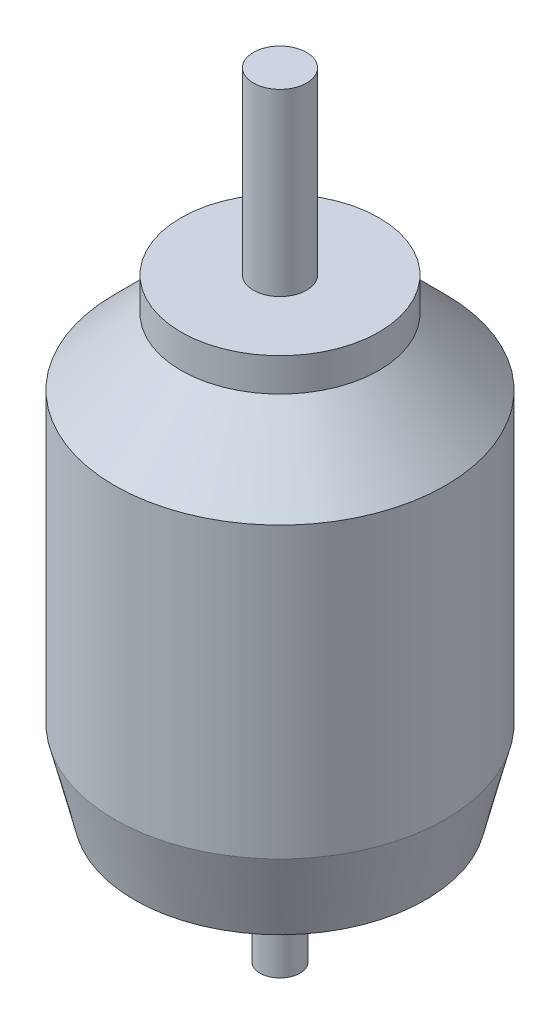
ISO-10303-21;
HEADER;
FILE_DESCRIPTION(('STEP AP214'),'2;1');
FILE_NAME('part.step','',(''),(''),'','','');
FILE_SCHEMA(('AUTOMOTIVE_DESIGN { 1 0 10303 214 1 1 1 1 }'));
ENDSEC;
DATA;
#1=APPLICATION_CONTEXT('core data for automotive mechanical design processes');
#2=APPLICATION_PROTOCOL_DEFINITION('international standard','automotive_design',2000,#1);
#3=PRODUCT_CONTEXT('',#1,'mechanical');
#4=PRODUCT('Part','Part','',(#3));
#5=PRODUCT_RELATED_PRODUCT_CATEGORY('part','',(#4));
#6=PRODUCT_DEFINITION_FORMATION('','',#4);
#7=PRODUCT_DEFINITION_CONTEXT('part definition',#1,'design');
#8=PRODUCT_DEFINITION('design','',#6,#7);
#9=PRODUCT_DEFINITION_SHAPE('','',#8);
#10=(LENGTH_UNIT() NAMED_UNIT(*) SI_UNIT(.MILLI.,.METRE.));
#11=(NAMED_UNIT(*) PLANE_ANGLE_UNIT() SI_UNIT($,.RADIAN.));
#12=(NAMED_UNIT(*) SI_UNIT($,.STERADIAN.) SOLID_ANGLE_UNIT());
#13=UNCERTAINTY_MEASURE_WITH_UNIT(LENGTH_MEASURE(1.E-05),#10,'distance_accuracy_value','');
#14=(GEOMETRIC_REPRESENTATION_CONTEXT(3) GLOBAL_UNCERTAINTY_ASSIGNED_CONTEXT((#13)) GLOBAL_UNIT_ASSIGNED_CONTEXT((#10,
#11,#12)) REPRESENTATION_CONTEXT('',''));
#15=CARTESIAN_POINT('',(0.,0.,0.));
#16=DIRECTION('',(0.,0.,1.));
#17=DIRECTION('',(1.,0.,0.));
#18=AXIS2_PLACEMENT_3D('',#15,#16,#17);
#19=CARTESIAN_POINT('',(0.,18.5,0.));
#20=DIRECTION('',(0.,-1.,0.));
#21=DIRECTION('',(0.,0.,-1.));
#22=AXIS2_PLACEMENT_3D('',#19,#20,#21);
#23=CYLINDRICAL_SURFACE('',#22,3.);
#24=CARTESIAN_POINT('',(0.,18.5,0.));
#25=DIRECTION('',(0.,1.,0.));
#26=DIRECTION('',(0.,0.,1.));
#27=AXIS2_PLACEMENT_3D('',#24,#25,#26);
#28=CIRCLE('',#27,3.);
#29=CARTESIAN_POINT('',(0.,18.5,3.));
#30=VERTEX_POINT('',#29);
#31=EDGE_CURVE('E123',#30,#30,#28,.T.);
#32=ORIENTED_EDGE('',*,*,#31,.F.);
#33=EDGE_LOOP('',(#32));
#34=FACE_BOUND('',#33,.T.);
#35=CARTESIAN_POINT('',(0.,0.,0.));
#36=DIRECTION('',(0.,1.,0.));
#37=DIRECTION('',(0.,0.,1.));
#38=AXIS2_PLACEMENT_3D('',#35,#36,#37);
#39=CIRCLE('',#38,3.);
#40=CARTESIAN_POINT('',(0.,0.,3.));
#41=VERTEX_POINT('',#40);
#42=EDGE_CURVE('E120',#41,#41,#39,.T.);
#43=ORIENTED_EDGE('',*,*,#42,.T.);
#44=EDGE_LOOP('',(#43));
#45=FACE_BOUND('',#44,.T.);
#46=ADVANCED_FACE('F43',(#34,#45),#23,.T.);
#47=CARTESIAN_POINT('',(0.,0.,0.));
#48=DIRECTION('',(0.,1.,0.));
#49=DIRECTION('',(0.,0.,1.));
#50=AXIS2_PLACEMENT_3D('',#47,#48,#49);
#51=PLANE('',#50);
#52=ORIENTED_EDGE('',*,*,#42,.F.);
#53=EDGE_LOOP('',(#52));
#54=FACE_BOUND('',#53,.T.);
#55=ADVANCED_FACE('F153',(#54),#51,.F.);
#56=CARTESIAN_POINT('',(0.,19.,0.));
#57=DIRECTION('',(0.,-1.,0.));
#58=DIRECTION('',(0.,0.,-1.));
#59=AXIS2_PLACEMENT_3D('',#56,#57,#58);
#60=CYLINDRICAL_SURFACE('',#59,6.);
#61=CARTESIAN_POINT('',(0.,19.,0.));
#62=DIRECTION('',(0.,1.,0.));
#63=DIRECTION('',(0.,0.,1.));
#64=AXIS2_PLACEMENT_3D('',#61,#62,#63);
#65=CIRCLE('',#64,6.);
#66=CARTESIAN_POINT('',(0.,19.,6.));
#67=VERTEX_POINT('',#66);
#68=EDGE_CURVE('E117',#67,#67,#65,.T.);
#69=ORIENTED_EDGE('',*,*,#68,.F.);
#70=EDGE_LOOP('',(#69));
#71=FACE_BOUND('',#70,.T.);
#72=CARTESIAN_POINT('',(0.,18.5,0.));
#73=DIRECTION('',(0.,1.,0.));
#74=DIRECTION('',(0.,0.,1.));
#75=AXIS2_PLACEMENT_3D('',#72,#73,#74);
#76=CIRCLE('',#75,6.);
#77=CARTESIAN_POINT('',(0.,18.5,6.));
#78=VERTEX_POINT('',#77);
#79=EDGE_CURVE('E116',#78,#78,#76,.T.);
#80=ORIENTED_EDGE('',*,*,#79,.T.);
#81=EDGE_LOOP('',(#80));
#82=FACE_BOUND('',#81,.T.);
#83=ADVANCED_FACE('F159',(#71,#82),#60,.T.);
#84=CARTESIAN_POINT('',(0.,18.5,0.));
#85=DIRECTION('',(0.,1.,0.));
#86=DIRECTION('',(0.,0.,1.));
#87=AXIS2_PLACEMENT_3D('',#84,#85,#86);
#88=PLANE('',#87);
#89=ORIENTED_EDGE('',*,*,#31,.T.);
#90=EDGE_LOOP('',(#89));
#91=FACE_BOUND('',#90,.T.);
#92=ORIENTED_EDGE('',*,*,#79,.F.);
#93=EDGE_LOOP('',(#92));
#94=FACE_BOUND('',#93,.T.);
#95=ADVANCED_FACE('F172',(#91,#94),#88,.F.);
#96=CARTESIAN_POINT('',(0.,84.5,0.));
#97=DIRECTION('',(0.,-1.,0.));
#98=DIRECTION('',(0.,0.,-1.));
#99=AXIS2_PLACEMENT_3D('',#96,#97,#98);
#100=CYLINDRICAL_SURFACE('',#99,24.9);
#101=CARTESIAN_POINT('',(0.,74.5,0.));
#102=DIRECTION('',(0.,1.,0.));
#103=DIRECTION('',(0.,0.,1.));
#104=AXIS2_PLACEMENT_3D('',#101,#102,#103);
#105=CIRCLE('',#104,24.9);
#106=CARTESIAN_POINT('',(0.,74.5,24.9));
#107=VERTEX_POINT('',#106);
#108=EDGE_CURVE('E11',#107,#107,#105,.F.);
#109=ORIENTED_EDGE('',*,*,#108,.T.);
#110=EDGE_LOOP('',(#109));
#111=FACE_BOUND('',#110,.T.);
#112=CARTESIAN_POINT('',(0.,31.,0.));
#113=DIRECTION('',(0.,1.,0.));
#114=DIRECTION('',(0.,0.,1.));
#115=AXIS2_PLACEMENT_3D('',#112,#113,#114);
#116=CIRCLE('',#115,24.9);
#117=CARTESIAN_POINT('',(0.,31.,24.9));
#118=VERTEX_POINT('',#117);
#119=EDGE_CURVE('E126',#118,#118,#116,.T.);
#120=ORIENTED_EDGE('',*,*,#119,.T.);
#121=EDGE_LOOP('',(#120));
#122=FACE_BOUND('',#121,.T.);
#123=ADVANCED_FACE('F176',(#111,#122),#100,.T.);
#124=CARTESIAN_POINT('',(0.,19.,0.));
#125=DIRECTION('',(0.,1.,0.));
#126=DIRECTION('',(0.,0.,1.));
#127=AXIS2_PLACEMENT_3D('',#124,#125,#126);
#128=PLANE('',#127);
#129=CARTESIAN_POINT('',(10.6066017177982,19.,-10.6066017177982));
#130=DIRECTION('',(0.,-1.,0.));
#131=DIRECTION('',(0.,0.,-1.));
#132=AXIS2_PLACEMENT_3D('',#129,#130,#131);
#133=CIRCLE('',#132,2.025);
#134=CARTESIAN_POINT('',(10.6066017177982,19.,-12.6316017177982));
#135=VERTEX_POINT('',#134);
#136=EDGE_CURVE('E83',#135,#135,#133,.T.);
#137=ORIENTED_EDGE('',*,*,#136,.F.);
#138=EDGE_LOOP('',(#137));
#139=FACE_BOUND('',#138,.T.);
#140=CARTESIAN_POINT('',(-10.6066017177982,19.,10.6066017177982));
#141=DIRECTION('',(0.,-1.,0.));
#142=DIRECTION('',(0.,0.,-1.));
#143=AXIS2_PLACEMENT_3D('',#140,#141,#142);
#144=CIRCLE('',#143,2.025);
#145=CARTESIAN_POINT('',(-10.6066017177982,19.,8.58160171779819));
#146=VERTEX_POINT('',#145);
#147=EDGE_CURVE('E76',#146,#146,#144,.T.);
#148=ORIENTED_EDGE('',*,*,#147,.F.);
#149=EDGE_LOOP('',(#148));
#150=FACE_BOUND('',#149,.T.);
#151=CARTESIAN_POINT('',(-10.6066017177982,19.,-10.6066017177982));
#152=DIRECTION('',(0.,-1.,0.));
#153=DIRECTION('',(0.,0.,-1.));
#154=AXIS2_PLACEMENT_3D('',#151,#152,#153);
#155=CIRCLE('',#154,2.025);
#156=CARTESIAN_POINT('',(-10.6066017177982,19.,-12.6316017177982));
#157=VERTEX_POINT('',#156);
#158=EDGE_CURVE('E92',#157,#157,#155,.T.);
#159=ORIENTED_EDGE('',*,*,#158,.F.);
#160=EDGE_LOOP('',(#159));
#161=FACE_BOUND('',#160,.T.);
#162=CARTESIAN_POINT('',(10.6066017177982,19.,10.6066017177982));
#163=DIRECTION('',(0.,-1.,0.));
#164=DIRECTION('',(0.,0.,-1.));
#165=AXIS2_PLACEMENT_3D('',#162,#163,#164);
#166=CIRCLE('',#165,2.025);
#167=CARTESIAN_POINT('',(10.6066017177982,19.,8.58160171779823));
#168=VERTEX_POINT('',#167);
#169=EDGE_CURVE('E101',#168,#168,#166,.T.);
#170=ORIENTED_EDGE('',*,*,#169,.F.);
#171=EDGE_LOOP('',(#170));
#172=FACE_BOUND('',#171,.T.);
#173=CARTESIAN_POINT('',(0.,19.,0.));
#174=DIRECTION('',(0.,1.,0.));
#175=DIRECTION('',(0.,0.,1.));
#176=AXIS2_PLACEMENT_3D('',#173,#174,#175);
#177=CIRCLE('',#176,21.9);
#178=CARTESIAN_POINT('',(0.,19.,21.9));
#179=VERTEX_POINT('',#178);
#180=EDGE_CURVE('E131',#179,#179,#177,.F.);
#181=ORIENTED_EDGE('',*,*,#180,.T.);
#182=EDGE_LOOP('',(#181));
#183=FACE_BOUND('',#182,.T.);
#184=ORIENTED_EDGE('',*,*,#68,.T.);
#185=EDGE_LOOP('',(#184));
#186=FACE_BOUND('',#185,.T.);
#187=ADVANCED_FACE('F149',(#139,#150,#161,#172,#183,#186),#128,.F.);
#188=CARTESIAN_POINT('',(0.,31.,0.));
#189=DIRECTION('',(0.,1.,0.));
#190=DIRECTION('',(0.,0.,1.));
#191=AXIS2_PLACEMENT_3D('',#188,#189,#190);
#192=CONICAL_SURFACE('',#191,24.9,0.244978663126861);
#193=ORIENTED_EDGE('',*,*,#180,.F.);
#194=EDGE_LOOP('',(#193));
#195=FACE_BOUND('',#194,.T.);
#196=ORIENTED_EDGE('',*,*,#119,.F.);
#197=EDGE_LOOP('',(#196));
#198=FACE_BOUND('',#197,.T.);
#199=ADVANCED_FACE('F140',(#195,#198),#192,.T.);
#200=CARTESIAN_POINT('',(0.,84.5,0.));
#201=DIRECTION('',(0.,-1.,0.));
#202=DIRECTION('',(0.,0.,-1.));
#203=AXIS2_PLACEMENT_3D('',#200,#201,#202);
#204=CONICAL_SURFACE('',#203,14.9,0.785398163397446);
#205=ORIENTED_EDGE('',*,*,#108,.F.);
#206=EDGE_LOOP('',(#205));
#207=FACE_BOUND('',#206,.T.);
#208=CARTESIAN_POINT('',(0.,84.5,0.));
#209=DIRECTION('',(0.,1.,0.));
#210=DIRECTION('',(0.,0.,1.));
#211=AXIS2_PLACEMENT_3D('',#208,#209,#210);
#212=CIRCLE('',#211,14.9);
#213=CARTESIAN_POINT('',(0.,84.5,14.9));
#214=VERTEX_POINT('',#213);
#215=EDGE_CURVE('E53',#214,#214,#212,.T.);
#216=ORIENTED_EDGE('',*,*,#215,.F.);
#217=EDGE_LOOP('',(#216));
#218=FACE_BOUND('',#217,.T.);
#219=ADVANCED_FACE('F46',(#207,#218),#204,.T.);
#220=CARTESIAN_POINT('',(0.,89.5,0.));
#221=DIRECTION('',(0.,-1.,0.));
#222=DIRECTION('',(0.,0.,-1.));
#223=AXIS2_PLACEMENT_3D('',#220,#221,#222);
#224=CYLINDRICAL_SURFACE('',#223,14.9);
#225=CARTESIAN_POINT('',(0.,89.5,0.));
#226=DIRECTION('',(0.,1.,0.));
#227=DIRECTION('',(0.,0.,1.));
#228=AXIS2_PLACEMENT_3D('',#225,#226,#227);
#229=CIRCLE('',#228,14.9);
#230=CARTESIAN_POINT('',(0.,89.5,14.9));
#231=VERTEX_POINT('',#230);
#232=EDGE_CURVE('E110',#231,#231,#229,.T.);
#233=ORIENTED_EDGE('',*,*,#232,.F.);
#234=EDGE_LOOP('',(#233));
#235=FACE_BOUND('',#234,.T.);
#236=ORIENTED_EDGE('',*,*,#215,.T.);
#237=EDGE_LOOP('',(#236));
#238=FACE_BOUND('',#237,.T.);
#239=ADVANCED_FACE('F137',(#235,#238),#224,.T.);
#240=CARTESIAN_POINT('',(0.,89.5,0.));
#241=DIRECTION('',(0.,1.,0.));
#242=DIRECTION('',(0.,0.,1.));
#243=AXIS2_PLACEMENT_3D('',#240,#241,#242);
#244=PLANE('',#243);
#245=CARTESIAN_POINT('',(0.,89.5,0.));
#246=DIRECTION('',(0.,1.,0.));
#247=DIRECTION('',(0.,0.,1.));
#248=AXIS2_PLACEMENT_3D('',#245,#246,#247);
#249=CIRCLE('',#248,4.);
#250=CARTESIAN_POINT('',(0.,89.5,4.));
#251=VERTEX_POINT('',#250);
#252=EDGE_CURVE('E48',#251,#251,#249,.T.);
#253=ORIENTED_EDGE('',*,*,#252,.F.);
#254=EDGE_LOOP('',(#253));
#255=FACE_BOUND('',#254,.T.);
#256=ORIENTED_EDGE('',*,*,#232,.T.);
#257=EDGE_LOOP('',(#256));
#258=FACE_BOUND('',#257,.T.);
#259=ADVANCED_FACE('F146',(#255,#258),#244,.T.);
#260=CARTESIAN_POINT('',(0.,116.5,0.));
#261=DIRECTION('',(0.,1.,0.));
#262=DIRECTION('',(0.,0.,1.));
#263=AXIS2_PLACEMENT_3D('',#260,#261,#262);
#264=PLANE('',#263);
#265=CARTESIAN_POINT('',(0.,116.5,0.));
#266=DIRECTION('',(0.,1.,0.));
#267=DIRECTION('',(0.,0.,1.));
#268=AXIS2_PLACEMENT_3D('',#265,#266,#267);
#269=CIRCLE('',#268,4.);
#270=CARTESIAN_POINT('',(0.,116.5,4.));
#271=VERTEX_POINT('',#270);
#272=EDGE_CURVE('E113',#271,#271,#269,.T.);
#273=ORIENTED_EDGE('',*,*,#272,.T.);
#274=EDGE_LOOP('',(#273));
#275=FACE_BOUND('',#274,.T.);
#276=ADVANCED_FACE('F188',(#275),#264,.T.);
#277=CARTESIAN_POINT('',(0.,116.5,0.));
#278=DIRECTION('',(0.,-1.,0.));
#279=DIRECTION('',(0.,0.,-1.));
#280=AXIS2_PLACEMENT_3D('',#277,#278,#279);
#281=CYLINDRICAL_SURFACE('',#280,4.);
#282=ORIENTED_EDGE('',*,*,#252,.T.);
#283=EDGE_LOOP('',(#282));
#284=FACE_BOUND('',#283,.T.);
#285=ORIENTED_EDGE('',*,*,#272,.F.);
#286=EDGE_LOOP('',(#285));
#287=FACE_BOUND('',#286,.T.);
#288=ADVANCED_FACE('F184',(#284,#287),#281,.T.);
#289=CARTESIAN_POINT('',(10.6066017177982,29.5085799786045,10.6066017177982));
#290=DIRECTION('',(0.,-1.,0.));
#291=DIRECTION('',(0.,0.,-1.));
#292=AXIS2_PLACEMENT_3D('',#289,#290,#291);
#293=CONICAL_SURFACE('',#292,1.65,1.02974425867665);
#294=CARTESIAN_POINT('',(10.6066017177982,30.5,10.6066017177982));
#295=VERTEX_POINT('',#294);
#296=VERTEX_LOOP('',#295);
#297=FACE_BOUND('',#296,.T.);
#298=CARTESIAN_POINT('',(10.6066017177982,29.5085799786045,10.6066017177982));
#299=DIRECTION('',(0.,-1.,0.));
#300=DIRECTION('',(0.,0.,-1.));
#301=AXIS2_PLACEMENT_3D('',#298,#299,#300);
#302=CIRCLE('',#301,1.65);
#303=CARTESIAN_POINT('',(10.6066017177982,29.5085799786045,8.95660171779823));
#304=VERTEX_POINT('',#303);
#305=EDGE_CURVE('E107',#304,#304,#302,.T.);
#306=ORIENTED_EDGE('',*,*,#305,.T.);
#307=EDGE_LOOP('',(#306));
#308=FACE_BOUND('',#307,.T.);
#309=ADVANCED_FACE('F187',(#297,#308),#293,.F.);
#310=CARTESIAN_POINT('',(10.6066017177982,19.,10.6066017177982));
#311=DIRECTION('',(0.,-1.,0.));
#312=DIRECTION('',(0.,0.,-1.));
#313=AXIS2_PLACEMENT_3D('',#310,#311,#312);
#314=CYLINDRICAL_SURFACE('',#313,1.65);
#315=ORIENTED_EDGE('',*,*,#305,.F.);
#316=EDGE_LOOP('',(#315));
#317=FACE_BOUND('',#316,.T.);
#318=CARTESIAN_POINT('',(10.6066017177982,19.375,10.6066017177982));
#319=DIRECTION('',(0.,-1.,0.));
#320=DIRECTION('',(0.,0.,-1.));
#321=AXIS2_PLACEMENT_3D('',#318,#319,#320);
#322=CIRCLE('',#321,1.65);
#323=CARTESIAN_POINT('',(10.6066017177982,19.375,8.95660171779823));
#324=VERTEX_POINT('',#323);
#325=EDGE_CURVE('E104',#324,#324,#322,.T.);
#326=ORIENTED_EDGE('',*,*,#325,.T.);
#327=EDGE_LOOP('',(#326));
#328=FACE_BOUND('',#327,.T.);
#329=ADVANCED_FACE('F198',(#317,#328),#314,.F.);
#330=CARTESIAN_POINT('',(10.6066017177982,19.,10.6066017177982));
#331=DIRECTION('',(0.,-1.,0.));
#332=DIRECTION('',(0.,0.,-1.));
#333=AXIS2_PLACEMENT_3D('',#330,#331,#332);
#334=CONICAL_SURFACE('',#333,2.025,0.785398163397444);
#335=ORIENTED_EDGE('',*,*,#325,.F.);
#336=EDGE_LOOP('',(#335));
#337=FACE_BOUND('',#336,.T.);
#338=ORIENTED_EDGE('',*,*,#169,.T.);
#339=EDGE_LOOP('',(#338));
#340=FACE_BOUND('',#339,.T.);
#341=ADVANCED_FACE('F201',(#337,#340),#334,.F.);
#342=CARTESIAN_POINT('',(-10.6066017177982,29.5085799786045,-10.6066017177982));
#343=DIRECTION('',(0.,-1.,0.));
#344=DIRECTION('',(0.,0.,-1.));
#345=AXIS2_PLACEMENT_3D('',#342,#343,#344);
#346=CONICAL_SURFACE('',#345,1.65,1.02974425867665);
#347=CARTESIAN_POINT('',(-10.6066017177982,30.5,-10.6066017177982));
#348=VERTEX_POINT('',#347);
#349=VERTEX_LOOP('',#348);
#350=FACE_BOUND('',#349,.T.);
#351=CARTESIAN_POINT('',(-10.6066017177982,29.5085799786045,-10.6066017177982));
#352=DIRECTION('',(0.,-1.,0.));
#353=DIRECTION('',(0.,0.,-1.));
#354=AXIS2_PLACEMENT_3D('',#351,#352,#353);
#355=CIRCLE('',#354,1.65);
#356=CARTESIAN_POINT('',(-10.6066017177982,29.5085799786045,-12.2566017177982));
#357=VERTEX_POINT('',#356);
#358=EDGE_CURVE('E98',#357,#357,#355,.T.);
#359=ORIENTED_EDGE('',*,*,#358,.T.);
#360=EDGE_LOOP('',(#359));
#361=FACE_BOUND('',#360,.T.);
#362=ADVANCED_FACE('F205',(#350,#361),#346,.F.);
#363=CARTESIAN_POINT('',(-10.6066017177982,19.,-10.6066017177982));
#364=DIRECTION('',(0.,-1.,0.));
#365=DIRECTION('',(0.,0.,-1.));
#366=AXIS2_PLACEMENT_3D('',#363,#364,#365);
#367=CYLINDRICAL_SURFACE('',#366,1.65);
#368=ORIENTED_EDGE('',*,*,#358,.F.);
#369=EDGE_LOOP('',(#368));
#370=FACE_BOUND('',#369,.T.);
#371=CARTESIAN_POINT('',(-10.6066017177982,19.375,-10.6066017177982));
#372=DIRECTION('',(0.,-1.,0.));
#373=DIRECTION('',(0.,0.,-1.));
#374=AXIS2_PLACEMENT_3D('',#371,#372,#373);
#375=CIRCLE('',#374,1.65);
#376=CARTESIAN_POINT('',(-10.6066017177982,19.375,-12.2566017177982));
#377=VERTEX_POINT('',#376);
#378=EDGE_CURVE('E95',#377,#377,#375,.T.);
#379=ORIENTED_EDGE('',*,*,#378,.T.);
#380=EDGE_LOOP('',(#379));
#381=FACE_BOUND('',#380,.T.);
#382=ADVANCED_FACE('F209',(#370,#381),#367,.F.);
#383=CARTESIAN_POINT('',(-10.6066017177982,19.,-10.6066017177982));
#384=DIRECTION('',(0.,-1.,0.));
#385=DIRECTION('',(0.,0.,-1.));
#386=AXIS2_PLACEMENT_3D('',#383,#384,#385);
#387=CONICAL_SURFACE('',#386,2.025,0.785398163397444);
#388=ORIENTED_EDGE('',*,*,#378,.F.);
#389=EDGE_LOOP('',(#388));
#390=FACE_BOUND('',#389,.T.);
#391=ORIENTED_EDGE('',*,*,#158,.T.);
#392=EDGE_LOOP('',(#391));
#393=FACE_BOUND('',#392,.T.);
#394=ADVANCED_FACE('F212',(#390,#393),#387,.F.);
#395=CARTESIAN_POINT('',(-10.6066017177982,29.5085799786045,10.6066017177982));
#396=DIRECTION('',(0.,-1.,0.));
#397=DIRECTION('',(0.,0.,-1.));
#398=AXIS2_PLACEMENT_3D('',#395,#396,#397);
#399=CONICAL_SURFACE('',#398,1.65,1.02974425867665);
#400=CARTESIAN_POINT('',(-10.6066017177982,30.5,10.6066017177982));
#401=VERTEX_POINT('',#400);
#402=VERTEX_LOOP('',#401);
#403=FACE_BOUND('',#402,.T.);
#404=CARTESIAN_POINT('',(-10.6066017177982,29.5085799786045,10.6066017177982));
#405=DIRECTION('',(0.,-1.,0.));
#406=DIRECTION('',(0.,0.,-1.));
#407=AXIS2_PLACEMENT_3D('',#404,#405,#406);
#408=CIRCLE('',#407,1.65);
#409=CARTESIAN_POINT('',(-10.6066017177982,29.5085799786045,8.95660171779819));
#410=VERTEX_POINT('',#409);
#411=EDGE_CURVE('E89',#410,#410,#408,.T.);
#412=ORIENTED_EDGE('',*,*,#411,.T.);
#413=EDGE_LOOP('',(#412));
#414=FACE_BOUND('',#413,.T.);
#415=ADVANCED_FACE('F216',(#403,#414),#399,.F.);
#416=CARTESIAN_POINT('',(-10.6066017177982,19.,10.6066017177982));
#417=DIRECTION('',(0.,-1.,0.));
#418=DIRECTION('',(0.,0.,-1.));
#419=AXIS2_PLACEMENT_3D('',#416,#417,#418);
#420=CYLINDRICAL_SURFACE('',#419,1.65);
#421=ORIENTED_EDGE('',*,*,#411,.F.);
#422=EDGE_LOOP('',(#421));
#423=FACE_BOUND('',#422,.T.);
#424=CARTESIAN_POINT('',(-10.6066017177982,19.375,10.6066017177982));
#425=DIRECTION('',(0.,-1.,0.));
#426=DIRECTION('',(0.,0.,-1.));
#427=AXIS2_PLACEMENT_3D('',#424,#425,#426);
#428=CIRCLE('',#427,1.65);
#429=CARTESIAN_POINT('',(-10.6066017177982,19.375,8.95660171779819));
#430=VERTEX_POINT('',#429);
#431=EDGE_CURVE('E80',#430,#430,#428,.T.);
#432=ORIENTED_EDGE('',*,*,#431,.T.);
#433=EDGE_LOOP('',(#432));
#434=FACE_BOUND('',#433,.T.);
#435=ADVANCED_FACE('F220',(#423,#434),#420,.F.);
#436=CARTESIAN_POINT('',(-10.6066017177982,19.,10.6066017177982));
#437=DIRECTION('',(0.,-1.,0.));
#438=DIRECTION('',(0.,0.,-1.));
#439=AXIS2_PLACEMENT_3D('',#436,#437,#438);
#440=CONICAL_SURFACE('',#439,2.025,0.785398163397444);
#441=ORIENTED_EDGE('',*,*,#431,.F.);
#442=EDGE_LOOP('',(#441));
#443=FACE_BOUND('',#442,.T.);
#444=ORIENTED_EDGE('',*,*,#147,.T.);
#445=EDGE_LOOP('',(#444));
#446=FACE_BOUND('',#445,.T.);
#447=ADVANCED_FACE('F70',(#443,#446),#440,.F.);
#448=CARTESIAN_POINT('',(10.6066017177982,29.5085799786045,-10.6066017177982));
#449=DIRECTION('',(0.,-1.,0.));
#450=DIRECTION('',(0.,0.,-1.));
#451=AXIS2_PLACEMENT_3D('',#448,#449,#450);
#452=CONICAL_SURFACE('',#451,1.65,1.02974425867665);
#453=CARTESIAN_POINT('',(10.6066017177982,30.5,-10.6066017177982));
#454=VERTEX_POINT('',#453);
#455=VERTEX_LOOP('',#454);
#456=FACE_BOUND('',#455,.T.);
#457=CARTESIAN_POINT('',(10.6066017177982,29.5085799786045,-10.6066017177982));
#458=DIRECTION('',(0.,-1.,0.));
#459=DIRECTION('',(0.,0.,-1.));
#460=AXIS2_PLACEMENT_3D('',#457,#458,#459);
#461=CIRCLE('',#460,1.65);
#462=CARTESIAN_POINT('',(10.6066017177982,29.5085799786045,-12.2566017177982));
#463=VERTEX_POINT('',#462);
#464=EDGE_CURVE('E74',#463,#463,#461,.T.);
#465=ORIENTED_EDGE('',*,*,#464,.T.);
#466=EDGE_LOOP('',(#465));
#467=FACE_BOUND('',#466,.T.);
#468=ADVANCED_FACE('F66',(#456,#467),#452,.F.);
#469=CARTESIAN_POINT('',(10.6066017177982,19.,-10.6066017177982));
#470=DIRECTION('',(0.,-1.,0.));
#471=DIRECTION('',(0.,0.,-1.));
#472=AXIS2_PLACEMENT_3D('',#469,#470,#471);
#473=CYLINDRICAL_SURFACE('',#472,1.65);
#474=ORIENTED_EDGE('',*,*,#464,.F.);
#475=EDGE_LOOP('',(#474));
#476=FACE_BOUND('',#475,.T.);
#477=CARTESIAN_POINT('',(10.6066017177982,19.375,-10.6066017177982));
#478=DIRECTION('',(0.,-1.,0.));
#479=DIRECTION('',(0.,0.,-1.));
#480=AXIS2_PLACEMENT_3D('',#477,#478,#479);
#481=CIRCLE('',#480,1.65);
#482=CARTESIAN_POINT('',(10.6066017177982,19.375,-12.2566017177982));
#483=VERTEX_POINT('',#482);
#484=EDGE_CURVE('E77',#483,#483,#481,.T.);
#485=ORIENTED_EDGE('',*,*,#484,.T.);
#486=EDGE_LOOP('',(#485));
#487=FACE_BOUND('',#486,.T.);
#488=ADVANCED_FACE('F69',(#476,#487),#473,.F.);
#489=CARTESIAN_POINT('',(10.6066017177982,19.,-10.6066017177982));
#490=DIRECTION('',(0.,-1.,0.));
#491=DIRECTION('',(0.,0.,-1.));
#492=AXIS2_PLACEMENT_3D('',#489,#490,#491);
#493=CONICAL_SURFACE('',#492,2.025,0.785398163397444);
#494=ORIENTED_EDGE('',*,*,#484,.F.);
#495=EDGE_LOOP('',(#494));
#496=FACE_BOUND('',#495,.T.);
#497=ORIENTED_EDGE('',*,*,#136,.T.);
#498=EDGE_LOOP('',(#497));
#499=FACE_BOUND('',#498,.T.);
#500=ADVANCED_FACE('F230',(#496,#499),#493,.F.);
#501=CLOSED_SHELL('',(#46,#55,#83,#95,#123,#187,#199,#219,#239,#259,#276,#288,#309,#329,#341,
#362,#382,#394,#415,#435,#447,#468,#488,#500));
#502=MANIFOLD_SOLID_BREP('B2',#501);
#503=ADVANCED_BREP_SHAPE_REPRESENTATION('',(#18,#502),#14);
#504=SHAPE_DEFINITION_REPRESENTATION(#9,#503);
ENDSEC;
END-ISO-10303-21;
